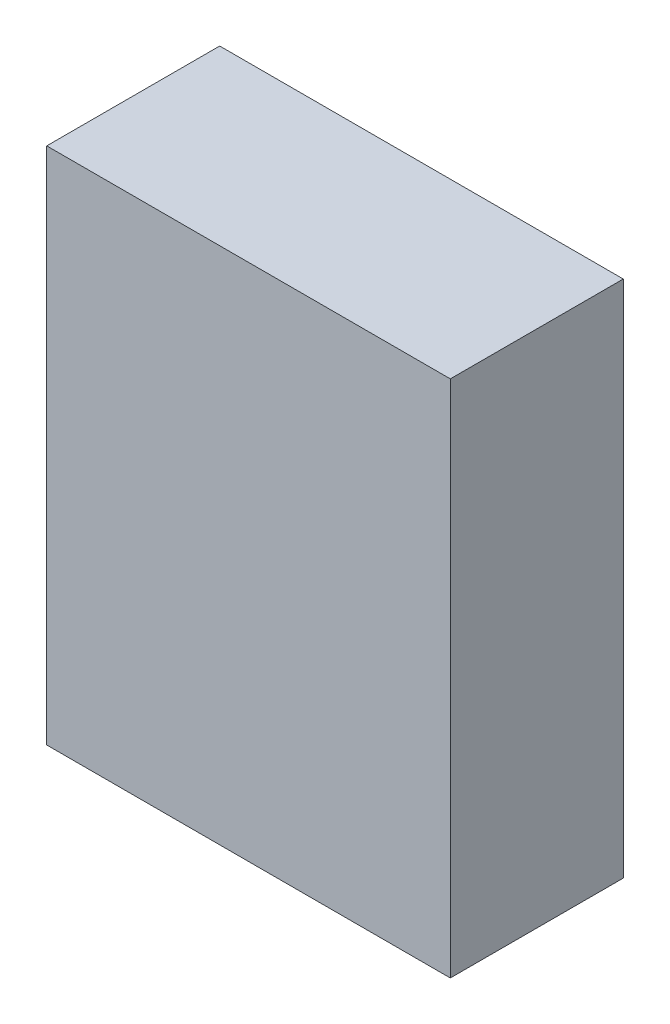
ISO-10303-21;
HEADER;
FILE_DESCRIPTION(('STEP AP214'),'2;1');
FILE_NAME('part.step','',(''),(''),'','','');
FILE_SCHEMA(('AUTOMOTIVE_DESIGN { 1 0 10303 214 1 1 1 1 }'));
ENDSEC;
DATA;
#1=APPLICATION_CONTEXT('core data for automotive mechanical design processes');
#2=APPLICATION_PROTOCOL_DEFINITION('international standard','automotive_design',2000,#1);
#3=PRODUCT_CONTEXT('',#1,'mechanical');
#4=PRODUCT('Part','Part','',(#3));
#5=PRODUCT_RELATED_PRODUCT_CATEGORY('part','',(#4));
#6=PRODUCT_DEFINITION_FORMATION('','',#4);
#7=PRODUCT_DEFINITION_CONTEXT('part definition',#1,'design');
#8=PRODUCT_DEFINITION('design','',#6,#7);
#9=PRODUCT_DEFINITION_SHAPE('','',#8);
#10=(LENGTH_UNIT() NAMED_UNIT(*) SI_UNIT(.MILLI.,.METRE.));
#11=(NAMED_UNIT(*) PLANE_ANGLE_UNIT() SI_UNIT($,.RADIAN.));
#12=(NAMED_UNIT(*) SI_UNIT($,.STERADIAN.) SOLID_ANGLE_UNIT());
#13=UNCERTAINTY_MEASURE_WITH_UNIT(LENGTH_MEASURE(1.E-05),#10,'distance_accuracy_value','');
#14=(GEOMETRIC_REPRESENTATION_CONTEXT(3) GLOBAL_UNCERTAINTY_ASSIGNED_CONTEXT((#13)) GLOBAL_UNIT_ASSIGNED_CONTEXT((#10,
#11,#12)) REPRESENTATION_CONTEXT('',''));
#15=CARTESIAN_POINT('',(0.,0.,0.));
#16=DIRECTION('',(0.,0.,1.));
#17=DIRECTION('',(1.,0.,0.));
#18=AXIS2_PLACEMENT_3D('',#15,#16,#17);
#19=CARTESIAN_POINT('',(38.5,-29.5,201.5));
#20=DIRECTION('',(0.,0.,1.));
#21=DIRECTION('',(1.,0.,0.));
#22=AXIS2_PLACEMENT_3D('',#19,#20,#21);
#23=PLANE('',#22);
#24=DIRECTION('',(-1.,0.,0.));
#25=VECTOR('',#24,1.);
#26=CARTESIAN_POINT('',(38.5,-29.5,201.5));
#27=LINE('',#26,#25);
#28=CARTESIAN_POINT('',(38.5,-29.5,201.5));
#29=VERTEX_POINT('',#28);
#30=CARTESIAN_POINT('',(3.5,-29.5,201.5));
#31=VERTEX_POINT('',#30);
#32=EDGE_CURVE('E92',#29,#31,#27,.T.);
#33=ORIENTED_EDGE('',*,*,#32,.F.);
#34=DIRECTION('',(0.,1.,0.));
#35=VECTOR('',#34,1.);
#36=CARTESIAN_POINT('',(38.5,-29.5,201.5));
#37=LINE('',#36,#35);
#38=CARTESIAN_POINT('',(38.5,15.5,201.5));
#39=VERTEX_POINT('',#38);
#40=EDGE_CURVE('E54',#29,#39,#37,.T.);
#41=ORIENTED_EDGE('',*,*,#40,.T.);
#42=DIRECTION('',(-1.,0.,0.));
#43=VECTOR('',#42,1.);
#44=CARTESIAN_POINT('',(38.5,15.5,201.5));
#45=LINE('',#44,#43);
#46=CARTESIAN_POINT('',(3.5,15.5,201.5));
#47=VERTEX_POINT('',#46);
#48=EDGE_CURVE('E18',#39,#47,#45,.T.);
#49=ORIENTED_EDGE('',*,*,#48,.T.);
#50=DIRECTION('',(0.,1.,0.));
#51=VECTOR('',#50,1.);
#52=CARTESIAN_POINT('',(3.5,-29.5,201.5));
#53=LINE('',#52,#51);
#54=EDGE_CURVE('E9',#31,#47,#53,.T.);
#55=ORIENTED_EDGE('',*,*,#54,.F.);
#56=EDGE_LOOP('',(#33,#41,#49,#55));
#57=FACE_BOUND('',#56,.T.);
#58=ADVANCED_FACE('F14',(#57),#23,.T.);
#59=CARTESIAN_POINT('',(38.5,-29.5,186.5));
#60=DIRECTION('',(0.,0.,1.));
#61=DIRECTION('',(1.,0.,0.));
#62=AXIS2_PLACEMENT_3D('',#59,#60,#61);
#63=PLANE('',#62);
#64=DIRECTION('',(0.,1.,0.));
#65=VECTOR('',#64,1.);
#66=CARTESIAN_POINT('',(3.5,-29.5,186.5));
#67=LINE('',#66,#65);
#68=CARTESIAN_POINT('',(3.5,-29.5,186.5));
#69=VERTEX_POINT('',#68);
#70=CARTESIAN_POINT('',(3.5,15.5,186.5));
#71=VERTEX_POINT('',#70);
#72=EDGE_CURVE('E25',#69,#71,#67,.T.);
#73=ORIENTED_EDGE('',*,*,#72,.T.);
#74=DIRECTION('',(-1.,0.,0.));
#75=VECTOR('',#74,1.);
#76=CARTESIAN_POINT('',(38.5,15.5,186.5));
#77=LINE('',#76,#75);
#78=CARTESIAN_POINT('',(38.5,15.5,186.5));
#79=VERTEX_POINT('',#78);
#80=EDGE_CURVE('E104',#79,#71,#77,.T.);
#81=ORIENTED_EDGE('',*,*,#80,.F.);
#82=DIRECTION('',(0.,1.,0.));
#83=VECTOR('',#82,1.);
#84=CARTESIAN_POINT('',(38.5,-29.5,186.5));
#85=LINE('',#84,#83);
#86=CARTESIAN_POINT('',(38.5,-29.5,186.5));
#87=VERTEX_POINT('',#86);
#88=EDGE_CURVE('E67',#87,#79,#85,.T.);
#89=ORIENTED_EDGE('',*,*,#88,.F.);
#90=DIRECTION('',(-1.,0.,0.));
#91=VECTOR('',#90,1.);
#92=CARTESIAN_POINT('',(38.5,-29.5,186.5));
#93=LINE('',#92,#91);
#94=EDGE_CURVE('E84',#87,#69,#93,.T.);
#95=ORIENTED_EDGE('',*,*,#94,.T.);
#96=EDGE_LOOP('',(#73,#81,#89,#95));
#97=FACE_BOUND('',#96,.T.);
#98=ADVANCED_FACE('F85',(#97),#63,.F.);
#99=CARTESIAN_POINT('',(3.5,-29.5,186.5));
#100=DIRECTION('',(-1.,0.,0.));
#101=DIRECTION('',(0.,0.,1.));
#102=AXIS2_PLACEMENT_3D('',#99,#100,#101);
#103=PLANE('',#102);
#104=ORIENTED_EDGE('',*,*,#72,.F.);
#105=DIRECTION('',(0.,0.,1.));
#106=VECTOR('',#105,1.);
#107=CARTESIAN_POINT('',(3.5,-29.5,186.5));
#108=LINE('',#107,#106);
#109=EDGE_CURVE('E75',#69,#31,#108,.T.);
#110=ORIENTED_EDGE('',*,*,#109,.T.);
#111=ORIENTED_EDGE('',*,*,#54,.T.);
#112=DIRECTION('',(0.,0.,1.));
#113=VECTOR('',#112,1.);
#114=CARTESIAN_POINT('',(3.5,15.5,186.5));
#115=LINE('',#114,#113);
#116=EDGE_CURVE('E78',#71,#47,#115,.T.);
#117=ORIENTED_EDGE('',*,*,#116,.F.);
#118=EDGE_LOOP('',(#104,#110,#111,#117));
#119=FACE_BOUND('',#118,.T.);
#120=ADVANCED_FACE('F73',(#119),#103,.T.);
#121=CARTESIAN_POINT('',(38.5,-29.5,186.5));
#122=DIRECTION('',(-1.,0.,0.));
#123=DIRECTION('',(0.,0.,1.));
#124=AXIS2_PLACEMENT_3D('',#121,#122,#123);
#125=PLANE('',#124);
#126=DIRECTION('',(0.,0.,1.));
#127=VECTOR('',#126,1.);
#128=CARTESIAN_POINT('',(38.5,15.5,186.5));
#129=LINE('',#128,#127);
#130=EDGE_CURVE('E102',#79,#39,#129,.T.);
#131=ORIENTED_EDGE('',*,*,#130,.T.);
#132=ORIENTED_EDGE('',*,*,#40,.F.);
#133=DIRECTION('',(0.,0.,1.));
#134=VECTOR('',#133,1.);
#135=CARTESIAN_POINT('',(38.5,-29.5,186.5));
#136=LINE('',#135,#134);
#137=EDGE_CURVE('E89',#87,#29,#136,.T.);
#138=ORIENTED_EDGE('',*,*,#137,.F.);
#139=ORIENTED_EDGE('',*,*,#88,.T.);
#140=EDGE_LOOP('',(#131,#132,#138,#139));
#141=FACE_BOUND('',#140,.T.);
#142=ADVANCED_FACE('F118',(#141),#125,.F.);
#143=CARTESIAN_POINT('',(38.5,15.5,186.5));
#144=DIRECTION('',(0.,1.,0.));
#145=DIRECTION('',(1.,0.,0.));
#146=AXIS2_PLACEMENT_3D('',#143,#144,#145);
#147=PLANE('',#146);
#148=ORIENTED_EDGE('',*,*,#130,.F.);
#149=ORIENTED_EDGE('',*,*,#80,.T.);
#150=ORIENTED_EDGE('',*,*,#116,.T.);
#151=ORIENTED_EDGE('',*,*,#48,.F.);
#152=EDGE_LOOP('',(#148,#149,#150,#151));
#153=FACE_BOUND('',#152,.T.);
#154=ADVANCED_FACE('F16',(#153),#147,.T.);
#155=CARTESIAN_POINT('',(38.5,-29.5,186.5));
#156=DIRECTION('',(0.,1.,0.));
#157=DIRECTION('',(1.,0.,0.));
#158=AXIS2_PLACEMENT_3D('',#155,#156,#157);
#159=PLANE('',#158);
#160=ORIENTED_EDGE('',*,*,#32,.T.);
#161=ORIENTED_EDGE('',*,*,#109,.F.);
#162=ORIENTED_EDGE('',*,*,#94,.F.);
#163=ORIENTED_EDGE('',*,*,#137,.T.);
#164=EDGE_LOOP('',(#160,#161,#162,#163));
#165=FACE_BOUND('',#164,.T.);
#166=ADVANCED_FACE('F91',(#165),#159,.F.);
#167=CLOSED_SHELL('',(#58,#98,#120,#142,#154,#166));
#168=MANIFOLD_SOLID_BREP('B1',#167);
#169=ADVANCED_BREP_SHAPE_REPRESENTATION('',(#18,#168),#14);
#170=SHAPE_DEFINITION_REPRESENTATION(#9,#169);
ENDSEC;
END-ISO-10303-21;
